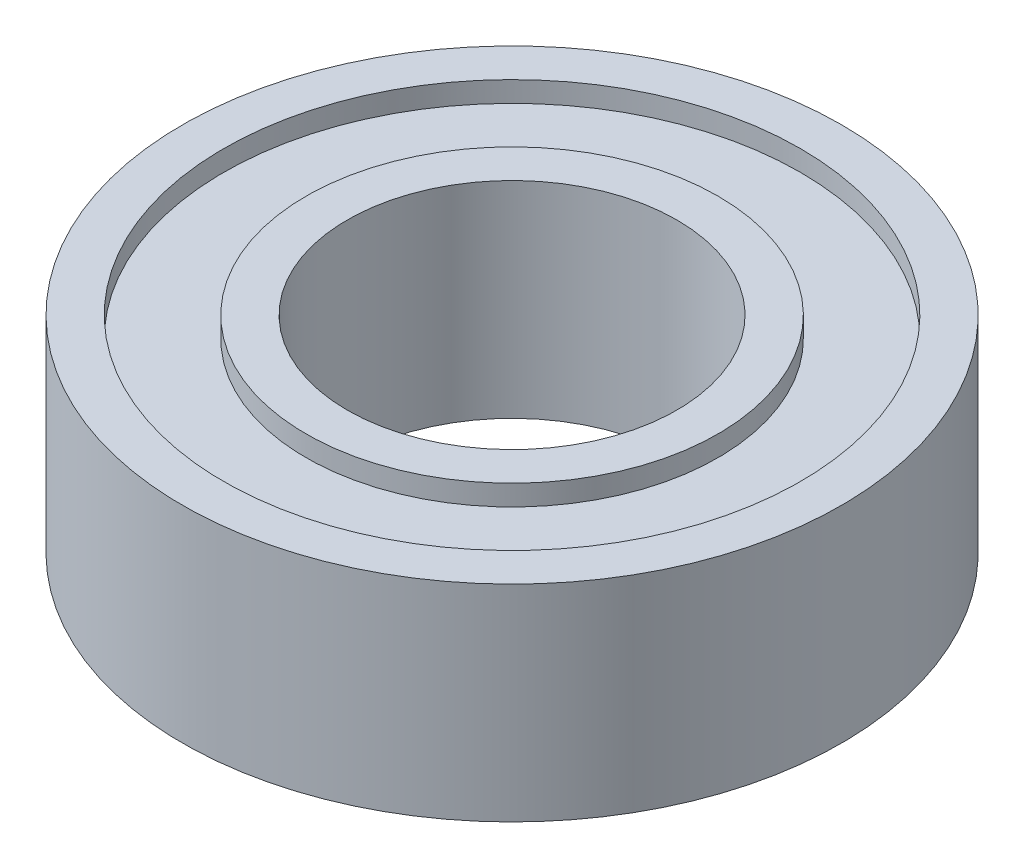
ISO-10303-21;
HEADER;
FILE_DESCRIPTION(('STEP AP214'),'2;1');
FILE_NAME('part.step','',(''),(''),'','','');
FILE_SCHEMA(('AUTOMOTIVE_DESIGN { 1 0 10303 214 1 1 1 1 }'));
ENDSEC;
DATA;
#1=APPLICATION_CONTEXT('core data for automotive mechanical design processes');
#2=APPLICATION_PROTOCOL_DEFINITION('international standard','automotive_design',2000,#1);
#3=PRODUCT_CONTEXT('',#1,'mechanical');
#4=PRODUCT('Part','Part','',(#3));
#5=PRODUCT_RELATED_PRODUCT_CATEGORY('part','',(#4));
#6=PRODUCT_DEFINITION_FORMATION('','',#4);
#7=PRODUCT_DEFINITION_CONTEXT('part definition',#1,'design');
#8=PRODUCT_DEFINITION('design','',#6,#7);
#9=PRODUCT_DEFINITION_SHAPE('','',#8);
#10=(LENGTH_UNIT() NAMED_UNIT(*) SI_UNIT(.MILLI.,.METRE.));
#11=(NAMED_UNIT(*) PLANE_ANGLE_UNIT() SI_UNIT($,.RADIAN.));
#12=(NAMED_UNIT(*) SI_UNIT($,.STERADIAN.) SOLID_ANGLE_UNIT());
#13=UNCERTAINTY_MEASURE_WITH_UNIT(LENGTH_MEASURE(1.E-05),#10,'distance_accuracy_value','');
#14=(GEOMETRIC_REPRESENTATION_CONTEXT(3) GLOBAL_UNCERTAINTY_ASSIGNED_CONTEXT((#13)) GLOBAL_UNIT_ASSIGNED_CONTEXT((#10,
#11,#12)) REPRESENTATION_CONTEXT('',''));
#15=CARTESIAN_POINT('',(0.,0.,0.));
#16=DIRECTION('',(0.,0.,1.));
#17=DIRECTION('',(1.,0.,0.));
#18=AXIS2_PLACEMENT_3D('',#15,#16,#17);
#19=CARTESIAN_POINT('',(0.,-3.98406557135279,0.));
#20=DIRECTION('',(0.,-1.,0.));
#21=DIRECTION('',(0.,0.,-1.));
#22=AXIS2_PLACEMENT_3D('',#19,#20,#21);
#23=CYLINDRICAL_SURFACE('',#22,7.);
#24=CARTESIAN_POINT('',(0.,-2.,0.));
#25=DIRECTION('',(0.,-1.,0.));
#26=DIRECTION('',(0.,0.,-1.));
#27=AXIS2_PLACEMENT_3D('',#24,#25,#26);
#28=CIRCLE('',#27,7.);
#29=CARTESIAN_POINT('',(0.,-2.,-7.));
#30=VERTEX_POINT('',#29);
#31=EDGE_CURVE('E82',#30,#30,#28,.T.);
#32=ORIENTED_EDGE('',*,*,#31,.F.);
#33=EDGE_LOOP('',(#32));
#34=FACE_BOUND('',#33,.T.);
#35=CARTESIAN_POINT('',(0.,-2.5,0.));
#36=DIRECTION('',(0.,-1.,0.));
#37=DIRECTION('',(0.,0.,-1.));
#38=AXIS2_PLACEMENT_3D('',#35,#36,#37);
#39=CIRCLE('',#38,7.);
#40=CARTESIAN_POINT('',(0.,-2.5,-7.));
#41=VERTEX_POINT('',#40);
#42=EDGE_CURVE('E12',#41,#41,#39,.T.);
#43=ORIENTED_EDGE('',*,*,#42,.T.);
#44=EDGE_LOOP('',(#43));
#45=FACE_BOUND('',#44,.T.);
#46=ADVANCED_FACE('F42',(#34,#45),#23,.F.);
#47=CARTESIAN_POINT('',(1.51031247495799,-2.5,0.));
#48=DIRECTION('',(0.,-1.,0.));
#49=DIRECTION('',(0.,0.,-1.));
#50=AXIS2_PLACEMENT_3D('',#47,#48,#49);
#51=PLANE('',#50);
#52=CARTESIAN_POINT('',(0.,-2.5,0.));
#53=DIRECTION('',(0.,-1.,0.));
#54=DIRECTION('',(0.,0.,-1.));
#55=AXIS2_PLACEMENT_3D('',#52,#53,#54);
#56=CIRCLE('',#55,8.);
#57=CARTESIAN_POINT('',(0.,-2.5,-8.));
#58=VERTEX_POINT('',#57);
#59=EDGE_CURVE('E48',#58,#58,#56,.T.);
#60=ORIENTED_EDGE('',*,*,#59,.T.);
#61=EDGE_LOOP('',(#60));
#62=FACE_BOUND('',#61,.T.);
#63=ORIENTED_EDGE('',*,*,#42,.F.);
#64=EDGE_LOOP('',(#63));
#65=FACE_BOUND('',#64,.T.);
#66=ADVANCED_FACE('F90',(#62,#65),#51,.T.);
#67=CARTESIAN_POINT('',(0.,-3.98406557135279,0.));
#68=DIRECTION('',(0.,-1.,0.));
#69=DIRECTION('',(0.,0.,-1.));
#70=AXIS2_PLACEMENT_3D('',#67,#68,#69);
#71=CYLINDRICAL_SURFACE('',#70,8.);
#72=ORIENTED_EDGE('',*,*,#59,.F.);
#73=EDGE_LOOP('',(#72));
#74=FACE_BOUND('',#73,.T.);
#75=CARTESIAN_POINT('',(0.,2.5,0.));
#76=DIRECTION('',(0.,-1.,0.));
#77=DIRECTION('',(0.,0.,-1.));
#78=AXIS2_PLACEMENT_3D('',#75,#76,#77);
#79=CIRCLE('',#78,8.);
#80=CARTESIAN_POINT('',(0.,2.5,-8.));
#81=VERTEX_POINT('',#80);
#82=EDGE_CURVE('E52',#81,#81,#79,.T.);
#83=ORIENTED_EDGE('',*,*,#82,.T.);
#84=EDGE_LOOP('',(#83));
#85=FACE_BOUND('',#84,.T.);
#86=ADVANCED_FACE('F94',(#74,#85),#71,.T.);
#87=CARTESIAN_POINT('',(1.51031247495799,2.5,0.));
#88=DIRECTION('',(0.,-1.,0.));
#89=DIRECTION('',(0.,0.,-1.));
#90=AXIS2_PLACEMENT_3D('',#87,#88,#89);
#91=PLANE('',#90);
#92=ORIENTED_EDGE('',*,*,#82,.F.);
#93=EDGE_LOOP('',(#92));
#94=FACE_BOUND('',#93,.T.);
#95=CARTESIAN_POINT('',(0.,2.5,0.));
#96=DIRECTION('',(0.,-1.,0.));
#97=DIRECTION('',(0.,0.,-1.));
#98=AXIS2_PLACEMENT_3D('',#95,#96,#97);
#99=CIRCLE('',#98,7.);
#100=CARTESIAN_POINT('',(0.,2.5,-7.));
#101=VERTEX_POINT('',#100);
#102=EDGE_CURVE('E56',#101,#101,#99,.T.);
#103=ORIENTED_EDGE('',*,*,#102,.T.);
#104=EDGE_LOOP('',(#103));
#105=FACE_BOUND('',#104,.T.);
#106=ADVANCED_FACE('F98',(#94,#105),#91,.F.);
#107=CARTESIAN_POINT('',(0.,-3.98406557135279,0.));
#108=DIRECTION('',(0.,-1.,0.));
#109=DIRECTION('',(0.,0.,-1.));
#110=AXIS2_PLACEMENT_3D('',#107,#108,#109);
#111=CYLINDRICAL_SURFACE('',#110,7.);
#112=CARTESIAN_POINT('',(0.,2.,0.));
#113=DIRECTION('',(0.,-1.,0.));
#114=DIRECTION('',(0.,0.,-1.));
#115=AXIS2_PLACEMENT_3D('',#112,#113,#114);
#116=CIRCLE('',#115,7.);
#117=CARTESIAN_POINT('',(0.,2.,-7.));
#118=VERTEX_POINT('',#117);
#119=EDGE_CURVE('E61',#118,#118,#116,.T.);
#120=ORIENTED_EDGE('',*,*,#119,.T.);
#121=EDGE_LOOP('',(#120));
#122=FACE_BOUND('',#121,.T.);
#123=ORIENTED_EDGE('',*,*,#102,.F.);
#124=EDGE_LOOP('',(#123));
#125=FACE_BOUND('',#124,.T.);
#126=ADVANCED_FACE('F105',(#122,#125),#111,.F.);
#127=CARTESIAN_POINT('',(1.51031247495799,2.,0.));
#128=DIRECTION('',(0.,-1.,0.));
#129=DIRECTION('',(0.,0.,-1.));
#130=AXIS2_PLACEMENT_3D('',#127,#128,#129);
#131=PLANE('',#130);
#132=ORIENTED_EDGE('',*,*,#119,.F.);
#133=EDGE_LOOP('',(#132));
#134=FACE_BOUND('',#133,.T.);
#135=CARTESIAN_POINT('',(0.,2.,0.));
#136=DIRECTION('',(0.,-1.,0.));
#137=DIRECTION('',(0.,0.,-1.));
#138=AXIS2_PLACEMENT_3D('',#135,#136,#137);
#139=CIRCLE('',#138,5.);
#140=CARTESIAN_POINT('',(0.,2.,-5.));
#141=VERTEX_POINT('',#140);
#142=EDGE_CURVE('E64',#141,#141,#139,.T.);
#143=ORIENTED_EDGE('',*,*,#142,.T.);
#144=EDGE_LOOP('',(#143));
#145=FACE_BOUND('',#144,.T.);
#146=ADVANCED_FACE('F109',(#134,#145),#131,.F.);
#147=CARTESIAN_POINT('',(0.,-3.98406557135279,0.));
#148=DIRECTION('',(0.,-1.,0.));
#149=DIRECTION('',(0.,0.,-1.));
#150=AXIS2_PLACEMENT_3D('',#147,#148,#149);
#151=CYLINDRICAL_SURFACE('',#150,5.);
#152=ORIENTED_EDGE('',*,*,#142,.F.);
#153=EDGE_LOOP('',(#152));
#154=FACE_BOUND('',#153,.T.);
#155=CARTESIAN_POINT('',(0.,2.5,0.));
#156=DIRECTION('',(0.,-1.,0.));
#157=DIRECTION('',(0.,0.,-1.));
#158=AXIS2_PLACEMENT_3D('',#155,#156,#157);
#159=CIRCLE('',#158,5.);
#160=CARTESIAN_POINT('',(0.,2.5,-5.));
#161=VERTEX_POINT('',#160);
#162=EDGE_CURVE('E67',#161,#161,#159,.T.);
#163=ORIENTED_EDGE('',*,*,#162,.T.);
#164=EDGE_LOOP('',(#163));
#165=FACE_BOUND('',#164,.T.);
#166=ADVANCED_FACE('F113',(#154,#165),#151,.T.);
#167=CARTESIAN_POINT('',(1.51031247495799,2.5,0.));
#168=DIRECTION('',(0.,-1.,0.));
#169=DIRECTION('',(0.,0.,-1.));
#170=AXIS2_PLACEMENT_3D('',#167,#168,#169);
#171=PLANE('',#170);
#172=ORIENTED_EDGE('',*,*,#162,.F.);
#173=EDGE_LOOP('',(#172));
#174=FACE_BOUND('',#173,.T.);
#175=CARTESIAN_POINT('',(0.,2.5,0.));
#176=DIRECTION('',(0.,-1.,0.));
#177=DIRECTION('',(0.,0.,-1.));
#178=AXIS2_PLACEMENT_3D('',#175,#176,#177);
#179=CIRCLE('',#178,4.);
#180=CARTESIAN_POINT('',(0.,2.5,-4.));
#181=VERTEX_POINT('',#180);
#182=EDGE_CURVE('E70',#181,#181,#179,.T.);
#183=ORIENTED_EDGE('',*,*,#182,.T.);
#184=EDGE_LOOP('',(#183));
#185=FACE_BOUND('',#184,.T.);
#186=ADVANCED_FACE('F117',(#174,#185),#171,.F.);
#187=CARTESIAN_POINT('',(0.,-3.98406557135279,0.));
#188=DIRECTION('',(0.,-1.,0.));
#189=DIRECTION('',(0.,0.,-1.));
#190=AXIS2_PLACEMENT_3D('',#187,#188,#189);
#191=CYLINDRICAL_SURFACE('',#190,4.);
#192=CARTESIAN_POINT('',(0.,-2.5,0.));
#193=DIRECTION('',(0.,-1.,0.));
#194=DIRECTION('',(0.,0.,-1.));
#195=AXIS2_PLACEMENT_3D('',#192,#193,#194);
#196=CIRCLE('',#195,4.);
#197=CARTESIAN_POINT('',(0.,-2.5,-4.));
#198=VERTEX_POINT('',#197);
#199=EDGE_CURVE('E73',#198,#198,#196,.T.);
#200=ORIENTED_EDGE('',*,*,#199,.T.);
#201=EDGE_LOOP('',(#200));
#202=FACE_BOUND('',#201,.T.);
#203=ORIENTED_EDGE('',*,*,#182,.F.);
#204=EDGE_LOOP('',(#203));
#205=FACE_BOUND('',#204,.T.);
#206=ADVANCED_FACE('F121',(#202,#205),#191,.F.);
#207=CARTESIAN_POINT('',(1.51031247495799,-2.5,0.));
#208=DIRECTION('',(0.,-1.,0.));
#209=DIRECTION('',(0.,0.,-1.));
#210=AXIS2_PLACEMENT_3D('',#207,#208,#209);
#211=PLANE('',#210);
#212=CARTESIAN_POINT('',(0.,-2.5,0.));
#213=DIRECTION('',(0.,-1.,0.));
#214=DIRECTION('',(0.,0.,-1.));
#215=AXIS2_PLACEMENT_3D('',#212,#213,#214);
#216=CIRCLE('',#215,5.);
#217=CARTESIAN_POINT('',(0.,-2.5,-5.));
#218=VERTEX_POINT('',#217);
#219=EDGE_CURVE('E76',#218,#218,#216,.T.);
#220=ORIENTED_EDGE('',*,*,#219,.T.);
#221=EDGE_LOOP('',(#220));
#222=FACE_BOUND('',#221,.T.);
#223=ORIENTED_EDGE('',*,*,#199,.F.);
#224=EDGE_LOOP('',(#223));
#225=FACE_BOUND('',#224,.T.);
#226=ADVANCED_FACE('F125',(#222,#225),#211,.T.);
#227=CARTESIAN_POINT('',(0.,-3.98406557135279,0.));
#228=DIRECTION('',(0.,-1.,0.));
#229=DIRECTION('',(0.,0.,-1.));
#230=AXIS2_PLACEMENT_3D('',#227,#228,#229);
#231=CYLINDRICAL_SURFACE('',#230,5.);
#232=CARTESIAN_POINT('',(0.,-2.,0.));
#233=DIRECTION('',(0.,-1.,0.));
#234=DIRECTION('',(0.,0.,-1.));
#235=AXIS2_PLACEMENT_3D('',#232,#233,#234);
#236=CIRCLE('',#235,5.);
#237=CARTESIAN_POINT('',(0.,-2.,-5.));
#238=VERTEX_POINT('',#237);
#239=EDGE_CURVE('E79',#238,#238,#236,.T.);
#240=ORIENTED_EDGE('',*,*,#239,.T.);
#241=EDGE_LOOP('',(#240));
#242=FACE_BOUND('',#241,.T.);
#243=ORIENTED_EDGE('',*,*,#219,.F.);
#244=EDGE_LOOP('',(#243));
#245=FACE_BOUND('',#244,.T.);
#246=ADVANCED_FACE('F129',(#242,#245),#231,.T.);
#247=CARTESIAN_POINT('',(1.51031247495799,-2.,0.));
#248=DIRECTION('',(0.,-1.,0.));
#249=DIRECTION('',(0.,0.,-1.));
#250=AXIS2_PLACEMENT_3D('',#247,#248,#249);
#251=PLANE('',#250);
#252=ORIENTED_EDGE('',*,*,#31,.T.);
#253=EDGE_LOOP('',(#252));
#254=FACE_BOUND('',#253,.T.);
#255=ORIENTED_EDGE('',*,*,#239,.F.);
#256=EDGE_LOOP('',(#255));
#257=FACE_BOUND('',#256,.T.);
#258=ADVANCED_FACE('F86',(#254,#257),#251,.T.);
#259=CLOSED_SHELL('',(#46,#66,#86,#106,#126,#146,#166,#186,#206,#226,#246,#258));
#260=MANIFOLD_SOLID_BREP('B2',#259);
#261=ADVANCED_BREP_SHAPE_REPRESENTATION('',(#18,#260),#14);
#262=SHAPE_DEFINITION_REPRESENTATION(#9,#261);
ENDSEC;
END-ISO-10303-21;
